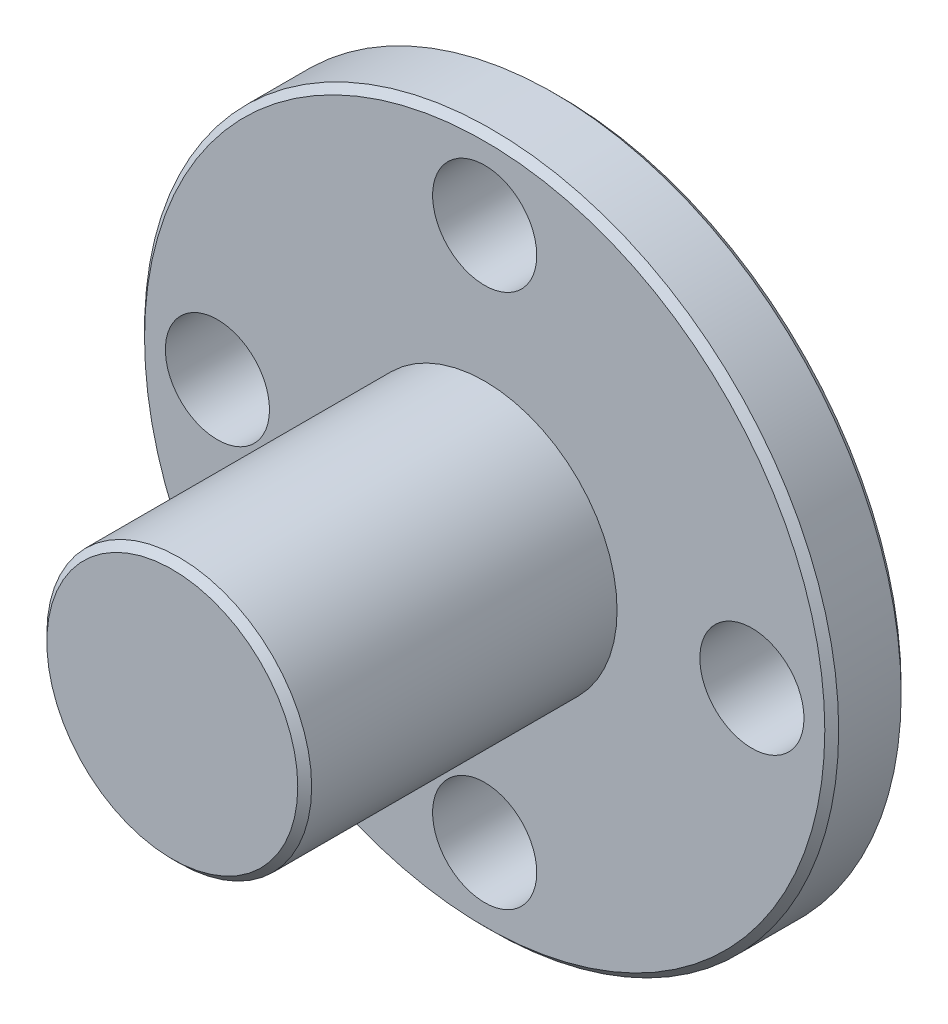
ISO-10303-21;
HEADER;
FILE_DESCRIPTION(('STEP AP214'),'2;1');
FILE_NAME('part.step','',(''),(''),'','','');
FILE_SCHEMA(('AUTOMOTIVE_DESIGN { 1 0 10303 214 1 1 1 1 }'));
ENDSEC;
DATA;
#1=APPLICATION_CONTEXT('core data for automotive mechanical design processes');
#2=APPLICATION_PROTOCOL_DEFINITION('international standard','automotive_design',2000,#1);
#3=PRODUCT_CONTEXT('',#1,'mechanical');
#4=PRODUCT('Part','Part','',(#3));
#5=PRODUCT_RELATED_PRODUCT_CATEGORY('part','',(#4));
#6=PRODUCT_DEFINITION_FORMATION('','',#4);
#7=PRODUCT_DEFINITION_CONTEXT('part definition',#1,'design');
#8=PRODUCT_DEFINITION('design','',#6,#7);
#9=PRODUCT_DEFINITION_SHAPE('','',#8);
#10=(LENGTH_UNIT() NAMED_UNIT(*) SI_UNIT(.MILLI.,.METRE.));
#11=(NAMED_UNIT(*) PLANE_ANGLE_UNIT() SI_UNIT($,.RADIAN.));
#12=(NAMED_UNIT(*) SI_UNIT($,.STERADIAN.) SOLID_ANGLE_UNIT());
#13=UNCERTAINTY_MEASURE_WITH_UNIT(LENGTH_MEASURE(1.E-05),#10,'distance_accuracy_value','');
#14=(GEOMETRIC_REPRESENTATION_CONTEXT(3) GLOBAL_UNCERTAINTY_ASSIGNED_CONTEXT((#13)) GLOBAL_UNIT_ASSIGNED_CONTEXT((#10,
#11,#12)) REPRESENTATION_CONTEXT('',''));
#15=CARTESIAN_POINT('',(0.,0.,0.));
#16=DIRECTION('',(0.,0.,1.));
#17=DIRECTION('',(1.,0.,0.));
#18=AXIS2_PLACEMENT_3D('',#15,#16,#17);
#19=CARTESIAN_POINT('',(0.,0.,2.2));
#20=DIRECTION('',(0.,0.,-1.));
#21=DIRECTION('',(-1.,0.,0.));
#22=AXIS2_PLACEMENT_3D('',#19,#20,#21);
#23=CYLINDRICAL_SURFACE('',#22,10.);
#24=CARTESIAN_POINT('',(0.,0.,1.99999999999999));
#25=DIRECTION('',(0.,0.,1.));
#26=DIRECTION('',(1.,0.,0.));
#27=AXIS2_PLACEMENT_3D('',#24,#25,#26);
#28=CIRCLE('',#27,10.);
#29=CARTESIAN_POINT('',(10.,0.,1.99999999999999));
#30=VERTEX_POINT('',#29);
#31=EDGE_CURVE('E49',#30,#30,#28,.F.);
#32=ORIENTED_EDGE('',*,*,#31,.T.);
#33=EDGE_LOOP('',(#32));
#34=FACE_BOUND('',#33,.T.);
#35=CARTESIAN_POINT('',(0.,0.,0.199999999999999));
#36=DIRECTION('',(0.,0.,1.));
#37=DIRECTION('',(1.,0.,0.));
#38=AXIS2_PLACEMENT_3D('',#35,#36,#37);
#39=CIRCLE('',#38,10.);
#40=CARTESIAN_POINT('',(10.,0.,0.199999999999999));
#41=VERTEX_POINT('',#40);
#42=EDGE_CURVE('E53',#41,#41,#39,.T.);
#43=ORIENTED_EDGE('',*,*,#42,.T.);
#44=EDGE_LOOP('',(#43));
#45=FACE_BOUND('',#44,.T.);
#46=ADVANCED_FACE('F41',(#34,#45),#23,.T.);
#47=CARTESIAN_POINT('',(0.,0.,2.2));
#48=DIRECTION('',(0.,0.,1.));
#49=DIRECTION('',(1.,0.,0.));
#50=AXIS2_PLACEMENT_3D('',#47,#48,#49);
#51=PLANE('',#50);
#52=CARTESIAN_POINT('',(0.,0.,2.2));
#53=DIRECTION('',(0.,0.,1.));
#54=DIRECTION('',(1.,0.,0.));
#55=AXIS2_PLACEMENT_3D('',#52,#53,#54);
#56=CIRCLE('',#55,9.79999999999999);
#57=CARTESIAN_POINT('',(9.79999999999999,0.,2.2));
#58=VERTEX_POINT('',#57);
#59=EDGE_CURVE('E57',#58,#58,#56,.T.);
#60=ORIENTED_EDGE('',*,*,#59,.T.);
#61=EDGE_LOOP('',(#60));
#62=FACE_BOUND('',#61,.T.);
#63=CARTESIAN_POINT('',(0.,0.,2.2));
#64=DIRECTION('',(0.,0.,1.));
#65=DIRECTION('',(1.,0.,0.));
#66=AXIS2_PLACEMENT_3D('',#63,#64,#65);
#67=CIRCLE('',#66,3.815);
#68=CARTESIAN_POINT('',(3.815,0.,2.2));
#69=VERTEX_POINT('',#68);
#70=EDGE_CURVE('E73',#69,#69,#67,.T.);
#71=ORIENTED_EDGE('',*,*,#70,.F.);
#72=EDGE_LOOP('',(#71));
#73=FACE_BOUND('',#72,.T.);
#74=CARTESIAN_POINT('',(0.,7.7,2.2));
#75=DIRECTION('',(0.,0.,1.));
#76=DIRECTION('',(1.,0.,0.));
#77=AXIS2_PLACEMENT_3D('',#74,#75,#76);
#78=CIRCLE('',#77,1.5);
#79=CARTESIAN_POINT('',(1.5,7.7,2.2));
#80=VERTEX_POINT('',#79);
#81=EDGE_CURVE('E88',#80,#80,#78,.T.);
#82=ORIENTED_EDGE('',*,*,#81,.F.);
#83=EDGE_LOOP('',(#82));
#84=FACE_BOUND('',#83,.T.);
#85=CARTESIAN_POINT('',(7.7000000000001,0.,2.2));
#86=DIRECTION('',(0.,0.,1.));
#87=DIRECTION('',(1.,0.,0.));
#88=AXIS2_PLACEMENT_3D('',#85,#86,#87);
#89=CIRCLE('',#88,1.5);
#90=CARTESIAN_POINT('',(9.2000000000001,0.,2.2));
#91=VERTEX_POINT('',#90);
#92=EDGE_CURVE('E85',#91,#91,#89,.T.);
#93=ORIENTED_EDGE('',*,*,#92,.F.);
#94=EDGE_LOOP('',(#93));
#95=FACE_BOUND('',#94,.T.);
#96=CARTESIAN_POINT('',(1.61329283265843E-13,-7.7,2.2));
#97=DIRECTION('',(0.,0.,1.));
#98=DIRECTION('',(1.,0.,0.));
#99=AXIS2_PLACEMENT_3D('',#96,#97,#98);
#100=CIRCLE('',#99,1.5);
#101=CARTESIAN_POINT('',(1.50000000000016,-7.7,2.2));
#102=VERTEX_POINT('',#101);
#103=EDGE_CURVE('E79',#102,#102,#100,.T.);
#104=ORIENTED_EDGE('',*,*,#103,.F.);
#105=EDGE_LOOP('',(#104));
#106=FACE_BOUND('',#105,.T.);
#107=CARTESIAN_POINT('',(-7.69999999999989,0.,2.2));
#108=DIRECTION('',(0.,0.,1.));
#109=DIRECTION('',(1.,0.,0.));
#110=AXIS2_PLACEMENT_3D('',#107,#108,#109);
#111=CIRCLE('',#110,1.5);
#112=CARTESIAN_POINT('',(-6.19999999999989,0.,2.2));
#113=VERTEX_POINT('',#112);
#114=EDGE_CURVE('E72',#113,#113,#111,.T.);
#115=ORIENTED_EDGE('',*,*,#114,.F.);
#116=EDGE_LOOP('',(#115));
#117=FACE_BOUND('',#116,.T.);
#118=ADVANCED_FACE('F98',(#62,#73,#84,#95,#106,#117),#51,.T.);
#119=CARTESIAN_POINT('',(0.,0.,0.));
#120=DIRECTION('',(0.,0.,1.));
#121=DIRECTION('',(1.,0.,0.));
#122=AXIS2_PLACEMENT_3D('',#119,#120,#121);
#123=PLANE('',#122);
#124=CARTESIAN_POINT('',(0.,0.,0.));
#125=DIRECTION('',(0.,0.,1.));
#126=DIRECTION('',(1.,0.,0.));
#127=AXIS2_PLACEMENT_3D('',#124,#125,#126);
#128=CIRCLE('',#127,9.79999999999999);
#129=CARTESIAN_POINT('',(9.79999999999999,0.,0.));
#130=VERTEX_POINT('',#129);
#131=EDGE_CURVE('E10',#130,#130,#128,.F.);
#132=ORIENTED_EDGE('',*,*,#131,.T.);
#133=EDGE_LOOP('',(#132));
#134=FACE_BOUND('',#133,.T.);
#135=CARTESIAN_POINT('',(0.,7.7,0.));
#136=DIRECTION('',(0.,0.,1.));
#137=DIRECTION('',(1.,0.,0.));
#138=AXIS2_PLACEMENT_3D('',#135,#136,#137);
#139=CIRCLE('',#138,1.5);
#140=CARTESIAN_POINT('',(1.5,7.7,0.));
#141=VERTEX_POINT('',#140);
#142=EDGE_CURVE('E68',#141,#141,#139,.T.);
#143=ORIENTED_EDGE('',*,*,#142,.T.);
#144=EDGE_LOOP('',(#143));
#145=FACE_BOUND('',#144,.T.);
#146=CARTESIAN_POINT('',(7.7000000000001,0.,0.));
#147=DIRECTION('',(0.,0.,1.));
#148=DIRECTION('',(1.,0.,0.));
#149=AXIS2_PLACEMENT_3D('',#146,#147,#148);
#150=CIRCLE('',#149,1.5);
#151=CARTESIAN_POINT('',(9.2000000000001,0.,0.));
#152=VERTEX_POINT('',#151);
#153=EDGE_CURVE('E82',#152,#152,#150,.T.);
#154=ORIENTED_EDGE('',*,*,#153,.T.);
#155=EDGE_LOOP('',(#154));
#156=FACE_BOUND('',#155,.T.);
#157=CARTESIAN_POINT('',(1.61329283265843E-13,-7.7,0.));
#158=DIRECTION('',(0.,0.,1.));
#159=DIRECTION('',(1.,0.,0.));
#160=AXIS2_PLACEMENT_3D('',#157,#158,#159);
#161=CIRCLE('',#160,1.5);
#162=CARTESIAN_POINT('',(1.50000000000016,-7.7,0.));
#163=VERTEX_POINT('',#162);
#164=EDGE_CURVE('E76',#163,#163,#161,.T.);
#165=ORIENTED_EDGE('',*,*,#164,.T.);
#166=EDGE_LOOP('',(#165));
#167=FACE_BOUND('',#166,.T.);
#168=CARTESIAN_POINT('',(-7.69999999999989,0.,0.));
#169=DIRECTION('',(0.,0.,1.));
#170=DIRECTION('',(1.,0.,0.));
#171=AXIS2_PLACEMENT_3D('',#168,#169,#170);
#172=CIRCLE('',#171,1.5);
#173=CARTESIAN_POINT('',(-6.19999999999989,0.,0.));
#174=VERTEX_POINT('',#173);
#175=EDGE_CURVE('E69',#174,#174,#172,.T.);
#176=ORIENTED_EDGE('',*,*,#175,.T.);
#177=EDGE_LOOP('',(#176));
#178=FACE_BOUND('',#177,.T.);
#179=ADVANCED_FACE('F101',(#134,#145,#156,#167,#178),#123,.F.);
#180=CARTESIAN_POINT('',(-7.69999999999989,0.,0.));
#181=DIRECTION('',(0.,0.,1.));
#182=DIRECTION('',(1.,0.,0.));
#183=AXIS2_PLACEMENT_3D('',#180,#181,#182);
#184=CYLINDRICAL_SURFACE('',#183,1.5);
#185=ORIENTED_EDGE('',*,*,#175,.F.);
#186=EDGE_LOOP('',(#185));
#187=FACE_BOUND('',#186,.T.);
#188=ORIENTED_EDGE('',*,*,#114,.T.);
#189=EDGE_LOOP('',(#188));
#190=FACE_BOUND('',#189,.T.);
#191=ADVANCED_FACE('F112',(#187,#190),#184,.F.);
#192=CARTESIAN_POINT('',(1.61329283265843E-13,-7.7,0.));
#193=DIRECTION('',(0.,0.,1.));
#194=DIRECTION('',(1.,0.,0.));
#195=AXIS2_PLACEMENT_3D('',#192,#193,#194);
#196=CYLINDRICAL_SURFACE('',#195,1.5);
#197=ORIENTED_EDGE('',*,*,#164,.F.);
#198=EDGE_LOOP('',(#197));
#199=FACE_BOUND('',#198,.T.);
#200=ORIENTED_EDGE('',*,*,#103,.T.);
#201=EDGE_LOOP('',(#200));
#202=FACE_BOUND('',#201,.T.);
#203=ADVANCED_FACE('F114',(#199,#202),#196,.F.);
#204=CARTESIAN_POINT('',(7.7000000000001,0.,0.));
#205=DIRECTION('',(0.,0.,1.));
#206=DIRECTION('',(1.,0.,0.));
#207=AXIS2_PLACEMENT_3D('',#204,#205,#206);
#208=CYLINDRICAL_SURFACE('',#207,1.5);
#209=ORIENTED_EDGE('',*,*,#153,.F.);
#210=EDGE_LOOP('',(#209));
#211=FACE_BOUND('',#210,.T.);
#212=ORIENTED_EDGE('',*,*,#92,.T.);
#213=EDGE_LOOP('',(#212));
#214=FACE_BOUND('',#213,.T.);
#215=ADVANCED_FACE('F121',(#211,#214),#208,.F.);
#216=CARTESIAN_POINT('',(0.,7.7,0.));
#217=DIRECTION('',(0.,0.,1.));
#218=DIRECTION('',(1.,0.,0.));
#219=AXIS2_PLACEMENT_3D('',#216,#217,#218);
#220=CYLINDRICAL_SURFACE('',#219,1.5);
#221=ORIENTED_EDGE('',*,*,#142,.F.);
#222=EDGE_LOOP('',(#221));
#223=FACE_BOUND('',#222,.T.);
#224=ORIENTED_EDGE('',*,*,#81,.T.);
#225=EDGE_LOOP('',(#224));
#226=FACE_BOUND('',#225,.T.);
#227=ADVANCED_FACE('F187',(#223,#226),#220,.F.);
#228=CARTESIAN_POINT('',(0.,0.,11.2));
#229=DIRECTION('',(0.,0.,-1.));
#230=DIRECTION('',(-1.,0.,0.));
#231=AXIS2_PLACEMENT_3D('',#228,#229,#230);
#232=CYLINDRICAL_SURFACE('',#231,3.815);
#233=CARTESIAN_POINT('',(0.,0.,11.));
#234=DIRECTION('',(0.,0.,1.));
#235=DIRECTION('',(1.,0.,0.));
#236=AXIS2_PLACEMENT_3D('',#233,#234,#235);
#237=CIRCLE('',#236,3.815);
#238=CARTESIAN_POINT('',(3.815,0.,11.));
#239=VERTEX_POINT('',#238);
#240=EDGE_CURVE('E62',#239,#239,#237,.F.);
#241=ORIENTED_EDGE('',*,*,#240,.T.);
#242=EDGE_LOOP('',(#241));
#243=FACE_BOUND('',#242,.T.);
#244=ORIENTED_EDGE('',*,*,#70,.T.);
#245=EDGE_LOOP('',(#244));
#246=FACE_BOUND('',#245,.T.);
#247=ADVANCED_FACE('F96',(#243,#246),#232,.T.);
#248=CARTESIAN_POINT('',(0.,0.,11.2));
#249=DIRECTION('',(0.,0.,1.));
#250=DIRECTION('',(1.,0.,0.));
#251=AXIS2_PLACEMENT_3D('',#248,#249,#250);
#252=PLANE('',#251);
#253=CARTESIAN_POINT('',(0.,0.,11.2));
#254=DIRECTION('',(0.,0.,1.));
#255=DIRECTION('',(1.,0.,0.));
#256=AXIS2_PLACEMENT_3D('',#253,#254,#255);
#257=CIRCLE('',#256,3.615);
#258=CARTESIAN_POINT('',(3.615,0.,11.2));
#259=VERTEX_POINT('',#258);
#260=EDGE_CURVE('E65',#259,#259,#257,.T.);
#261=ORIENTED_EDGE('',*,*,#260,.T.);
#262=EDGE_LOOP('',(#261));
#263=FACE_BOUND('',#262,.T.);
#264=ADVANCED_FACE('F139',(#263),#252,.T.);
#265=CARTESIAN_POINT('',(0.,0.,11.2));
#266=DIRECTION('',(0.,0.,-1.));
#267=DIRECTION('',(-1.,0.,0.));
#268=AXIS2_PLACEMENT_3D('',#265,#266,#267);
#269=CONICAL_SURFACE('',#268,3.615,0.785398163397441);
#270=ORIENTED_EDGE('',*,*,#240,.F.);
#271=EDGE_LOOP('',(#270));
#272=FACE_BOUND('',#271,.T.);
#273=ORIENTED_EDGE('',*,*,#260,.F.);
#274=EDGE_LOOP('',(#273));
#275=FACE_BOUND('',#274,.T.);
#276=ADVANCED_FACE('F133',(#272,#275),#269,.T.);
#277=CARTESIAN_POINT('',(0.,0.,2.2));
#278=DIRECTION('',(0.,0.,-1.));
#279=DIRECTION('',(-1.,0.,0.));
#280=AXIS2_PLACEMENT_3D('',#277,#278,#279);
#281=CONICAL_SURFACE('',#280,9.79999999999999,0.78539816339744);
#282=ORIENTED_EDGE('',*,*,#31,.F.);
#283=EDGE_LOOP('',(#282));
#284=FACE_BOUND('',#283,.T.);
#285=ORIENTED_EDGE('',*,*,#59,.F.);
#286=EDGE_LOOP('',(#285));
#287=FACE_BOUND('',#286,.T.);
#288=ADVANCED_FACE('F138',(#284,#287),#281,.T.);
#289=CARTESIAN_POINT('',(0.,0.,0.199999999999999));
#290=DIRECTION('',(0.,0.,1.));
#291=DIRECTION('',(1.,0.,0.));
#292=AXIS2_PLACEMENT_3D('',#289,#290,#291);
#293=CONICAL_SURFACE('',#292,10.,0.785398163397457);
#294=ORIENTED_EDGE('',*,*,#131,.F.);
#295=EDGE_LOOP('',(#294));
#296=FACE_BOUND('',#295,.T.);
#297=ORIENTED_EDGE('',*,*,#42,.F.);
#298=EDGE_LOOP('',(#297));
#299=FACE_BOUND('',#298,.T.);
#300=ADVANCED_FACE('F44',(#296,#299),#293,.T.);
#301=CLOSED_SHELL('',(#46,#118,#179,#191,#203,#215,#227,#247,#264,#276,#288,#300));
#302=MANIFOLD_SOLID_BREP('B2',#301);
#303=ADVANCED_BREP_SHAPE_REPRESENTATION('',(#18,#302),#14);
#304=SHAPE_DEFINITION_REPRESENTATION(#9,#303);
ENDSEC;
END-ISO-10303-21;
